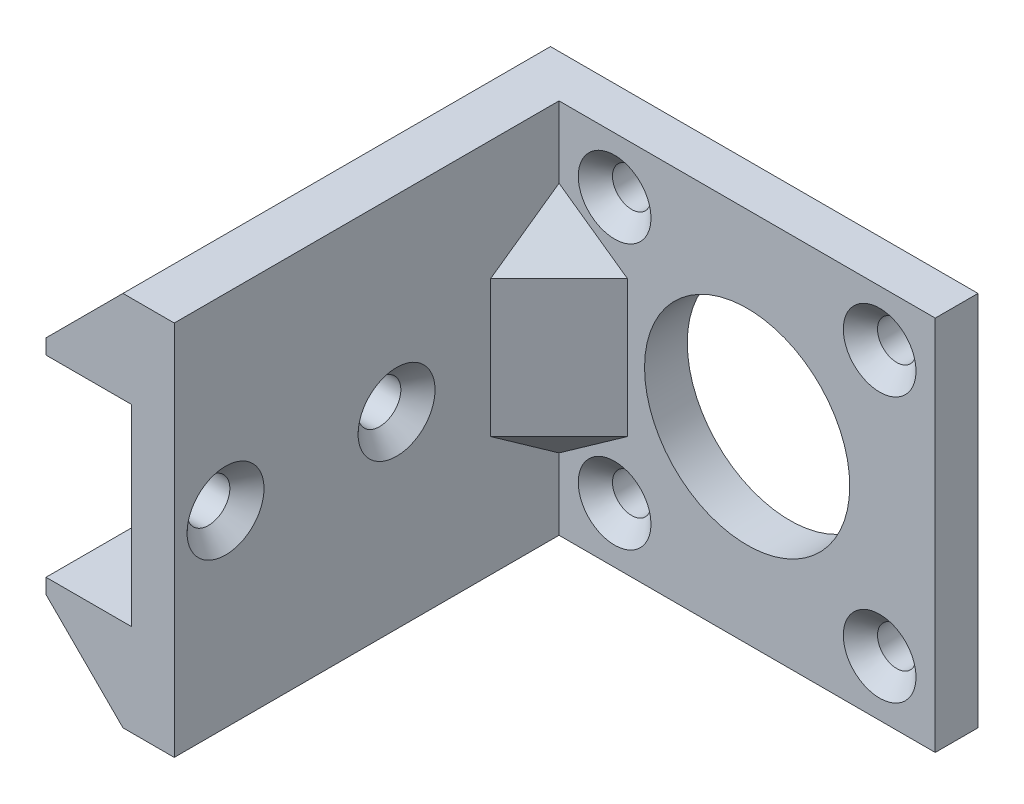
ISO-10303-21;
HEADER;
FILE_DESCRIPTION(('STEP AP214'),'2;1');
FILE_NAME('part.step','',(''),(''),'','','');
FILE_SCHEMA(('AUTOMOTIVE_DESIGN { 1 0 10303 214 1 1 1 1 }'));
ENDSEC;
DATA;
#1=APPLICATION_CONTEXT('core data for automotive mechanical design processes');
#2=APPLICATION_PROTOCOL_DEFINITION('international standard','automotive_design',2000,#1);
#3=PRODUCT_CONTEXT('',#1,'mechanical');
#4=PRODUCT('Part','Part','',(#3));
#5=PRODUCT_RELATED_PRODUCT_CATEGORY('part','',(#4));
#6=PRODUCT_DEFINITION_FORMATION('','',#4);
#7=PRODUCT_DEFINITION_CONTEXT('part definition',#1,'design');
#8=PRODUCT_DEFINITION('design','',#6,#7);
#9=PRODUCT_DEFINITION_SHAPE('','',#8);
#10=(LENGTH_UNIT() NAMED_UNIT(*) SI_UNIT(.MILLI.,.METRE.));
#11=(NAMED_UNIT(*) PLANE_ANGLE_UNIT() SI_UNIT($,.RADIAN.));
#12=(NAMED_UNIT(*) SI_UNIT($,.STERADIAN.) SOLID_ANGLE_UNIT());
#13=UNCERTAINTY_MEASURE_WITH_UNIT(LENGTH_MEASURE(1.E-05),#10,'distance_accuracy_value','');
#14=(GEOMETRIC_REPRESENTATION_CONTEXT(3) GLOBAL_UNCERTAINTY_ASSIGNED_CONTEXT((#13)) GLOBAL_UNIT_ASSIGNED_CONTEXT((#10,
#11,#12)) REPRESENTATION_CONTEXT('',''));
#15=CARTESIAN_POINT('',(0.,0.,0.));
#16=DIRECTION('',(0.,0.,1.));
#17=DIRECTION('',(1.,0.,0.));
#18=AXIS2_PLACEMENT_3D('',#15,#16,#17);
#19=CARTESIAN_POINT('',(-27.,0.,0.));
#20=DIRECTION('',(-1.,0.,0.));
#21=DIRECTION('',(0.,-1.,0.));
#22=AXIS2_PLACEMENT_3D('',#19,#20,#21);
#23=PLANE('',#22);
#24=CARTESIAN_POINT('',(-27.,0.,44.));
#25=DIRECTION('',(-1.,0.,0.));
#26=DIRECTION('',(0.,-1.,0.));
#27=AXIS2_PLACEMENT_3D('',#24,#25,#26);
#28=CIRCLE('',#27,2.5);
#29=CARTESIAN_POINT('',(-27.,-2.5,44.));
#30=VERTEX_POINT('',#29);
#31=EDGE_CURVE('E196',#30,#30,#28,.T.);
#32=ORIENTED_EDGE('',*,*,#31,.F.);
#33=EDGE_LOOP('',(#32));
#34=FACE_BOUND('',#33,.T.);
#35=CARTESIAN_POINT('',(-27.,0.,24.));
#36=DIRECTION('',(-1.,0.,0.));
#37=DIRECTION('',(0.,-1.,0.));
#38=AXIS2_PLACEMENT_3D('',#35,#36,#37);
#39=CIRCLE('',#38,2.5);
#40=CARTESIAN_POINT('',(-27.,-2.5,24.));
#41=VERTEX_POINT('',#40);
#42=EDGE_CURVE('E193',#41,#41,#39,.T.);
#43=ORIENTED_EDGE('',*,*,#42,.F.);
#44=EDGE_LOOP('',(#43));
#45=FACE_BOUND('',#44,.T.);
#46=DIRECTION('',(0.,-1.,0.));
#47=VECTOR('',#46,1.);
#48=CARTESIAN_POINT('',(-27.,22.,0.));
#49=LINE('',#48,#47);
#50=CARTESIAN_POINT('',(-27.,11.25,0.));
#51=VERTEX_POINT('',#50);
#52=CARTESIAN_POINT('',(-27.,-11.25,0.));
#53=VERTEX_POINT('',#52);
#54=EDGE_CURVE('E200',#51,#53,#49,.T.);
#55=ORIENTED_EDGE('',*,*,#54,.T.);
#56=DIRECTION('',(0.,0.,-1.));
#57=VECTOR('',#56,1.);
#58=CARTESIAN_POINT('',(-27.,-11.25,50.));
#59=LINE('',#58,#57);
#60=CARTESIAN_POINT('',(-27.,-11.25,50.));
#61=VERTEX_POINT('',#60);
#62=EDGE_CURVE('E152',#61,#53,#59,.T.);
#63=ORIENTED_EDGE('',*,*,#62,.F.);
#64=DIRECTION('',(0.,1.,0.));
#65=VECTOR('',#64,1.);
#66=CARTESIAN_POINT('',(-27.,22.,50.));
#67=LINE('',#66,#65);
#68=CARTESIAN_POINT('',(-27.,11.25,50.));
#69=VERTEX_POINT('',#68);
#70=EDGE_CURVE('E166',#61,#69,#67,.T.);
#71=ORIENTED_EDGE('',*,*,#70,.T.);
#72=DIRECTION('',(0.,0.,1.));
#73=VECTOR('',#72,1.);
#74=CARTESIAN_POINT('',(-27.,11.25,50.));
#75=LINE('',#74,#73);
#76=EDGE_CURVE('E168',#51,#69,#75,.T.);
#77=ORIENTED_EDGE('',*,*,#76,.F.);
#78=EDGE_LOOP('',(#55,#63,#71,#77));
#79=FACE_BOUND('',#78,.T.);
#80=ADVANCED_FACE('F34',(#34,#45,#79),#23,.T.);
#81=CARTESIAN_POINT('',(0.,0.,5.));
#82=DIRECTION('',(0.,0.,-1.));
#83=DIRECTION('',(-1.,0.,0.));
#84=AXIS2_PLACEMENT_3D('',#81,#82,#83);
#85=PLANE('',#84);
#86=CARTESIAN_POINT('',(-15.5,-15.5,5.));
#87=DIRECTION('',(0.,0.,-1.));
#88=DIRECTION('',(-1.,0.,0.));
#89=AXIS2_PLACEMENT_3D('',#86,#87,#88);
#90=CIRCLE('',#89,4.25000000000002);
#91=CARTESIAN_POINT('',(-19.75,-15.5,5.));
#92=VERTEX_POINT('',#91);
#93=EDGE_CURVE('E311',#92,#92,#90,.T.);
#94=ORIENTED_EDGE('',*,*,#93,.T.);
#95=EDGE_LOOP('',(#94));
#96=FACE_BOUND('',#95,.T.);
#97=CARTESIAN_POINT('',(15.5000000000001,-15.4999999999999,5.));
#98=DIRECTION('',(0.,0.,-1.));
#99=DIRECTION('',(-1.,0.,0.));
#100=AXIS2_PLACEMENT_3D('',#97,#98,#99);
#101=CIRCLE('',#100,4.25000000000002);
#102=CARTESIAN_POINT('',(11.25,-15.4999999999999,5.));
#103=VERTEX_POINT('',#102);
#104=EDGE_CURVE('E308',#103,#103,#101,.T.);
#105=ORIENTED_EDGE('',*,*,#104,.T.);
#106=EDGE_LOOP('',(#105));
#107=FACE_BOUND('',#106,.T.);
#108=CARTESIAN_POINT('',(-15.5000000000002,15.4999999999998,5.));
#109=DIRECTION('',(0.,0.,-1.));
#110=DIRECTION('',(-1.,0.,0.));
#111=AXIS2_PLACEMENT_3D('',#108,#109,#110);
#112=CIRCLE('',#111,4.25);
#113=CARTESIAN_POINT('',(-19.7500000000002,15.4999999999998,5.));
#114=VERTEX_POINT('',#113);
#115=EDGE_CURVE('E305',#114,#114,#112,.T.);
#116=ORIENTED_EDGE('',*,*,#115,.T.);
#117=EDGE_LOOP('',(#116));
#118=FACE_BOUND('',#117,.T.);
#119=CARTESIAN_POINT('',(15.5,15.5,5.));
#120=DIRECTION('',(0.,0.,-1.));
#121=DIRECTION('',(-1.,0.,0.));
#122=AXIS2_PLACEMENT_3D('',#119,#120,#121);
#123=CIRCLE('',#122,4.25000000000002);
#124=CARTESIAN_POINT('',(11.25,15.5,5.));
#125=VERTEX_POINT('',#124);
#126=EDGE_CURVE('E302',#125,#125,#123,.T.);
#127=ORIENTED_EDGE('',*,*,#126,.T.);
#128=EDGE_LOOP('',(#127));
#129=FACE_BOUND('',#128,.T.);
#130=CARTESIAN_POINT('',(0.,0.,5.));
#131=DIRECTION('',(0.,0.,1.));
#132=DIRECTION('',(1.,0.,0.));
#133=AXIS2_PLACEMENT_3D('',#130,#131,#132);
#134=CIRCLE('',#133,12.);
#135=CARTESIAN_POINT('',(12.,0.,5.));
#136=VERTEX_POINT('',#135);
#137=EDGE_CURVE('E216',#136,#136,#134,.T.);
#138=ORIENTED_EDGE('',*,*,#137,.F.);
#139=EDGE_LOOP('',(#138));
#140=FACE_BOUND('',#139,.T.);
#141=DIRECTION('',(0.,-1.,0.));
#142=VECTOR('',#141,1.);
#143=CARTESIAN_POINT('',(-22.,22.,5.));
#144=LINE('',#143,#142);
#145=CARTESIAN_POINT('',(-22.,22.,5.));
#146=VERTEX_POINT('',#145);
#147=CARTESIAN_POINT('',(-22.,13.6568542494923,5.));
#148=VERTEX_POINT('',#147);
#149=EDGE_CURVE('E242',#146,#148,#144,.T.);
#150=ORIENTED_EDGE('',*,*,#149,.T.);
#151=DIRECTION('',(0.816496580927729,-0.577350269189622,0.));
#152=VECTOR('',#151,1.);
#153=CARTESIAN_POINT('',(-0.895430500338385,-1.26632995774108,5.));
#154=LINE('',#153,#152);
#155=CARTESIAN_POINT('',(-14.,7.99999999999995,5.));
#156=VERTEX_POINT('',#155);
#157=EDGE_CURVE('E271',#148,#156,#154,.T.);
#158=ORIENTED_EDGE('',*,*,#157,.T.);
#159=DIRECTION('',(0.,-1.,0.));
#160=VECTOR('',#159,1.);
#161=CARTESIAN_POINT('',(-14.,15.,5.));
#162=LINE('',#161,#160);
#163=CARTESIAN_POINT('',(-14.,-7.99999999999988,5.));
#164=VERTEX_POINT('',#163);
#165=EDGE_CURVE('E187',#156,#164,#162,.T.);
#166=ORIENTED_EDGE('',*,*,#165,.T.);
#167=DIRECTION('',(0.816496580927723,0.57735026918963,0.));
#168=VECTOR('',#167,1.);
#169=CARTESIAN_POINT('',(-0.895430500338526,1.26632995774126,5.));
#170=LINE('',#169,#168);
#171=CARTESIAN_POINT('',(-22.,-13.6568542494923,5.));
#172=VERTEX_POINT('',#171);
#173=EDGE_CURVE('E263',#164,#172,#170,.F.);
#174=ORIENTED_EDGE('',*,*,#173,.T.);
#175=CARTESIAN_POINT('',(-22.,-22.,5.));
#176=VERTEX_POINT('',#175);
#177=EDGE_CURVE('E241',#172,#176,#144,.T.);
#178=ORIENTED_EDGE('',*,*,#177,.T.);
#179=DIRECTION('',(1.,0.,0.));
#180=VECTOR('',#179,1.);
#181=CARTESIAN_POINT('',(22.,-22.,5.));
#182=LINE('',#181,#180);
#183=CARTESIAN_POINT('',(22.,-22.,5.));
#184=VERTEX_POINT('',#183);
#185=EDGE_CURVE('E244',#176,#184,#182,.T.);
#186=ORIENTED_EDGE('',*,*,#185,.T.);
#187=DIRECTION('',(0.,1.,0.));
#188=VECTOR('',#187,1.);
#189=CARTESIAN_POINT('',(22.,22.,5.));
#190=LINE('',#189,#188);
#191=CARTESIAN_POINT('',(22.,22.,5.));
#192=VERTEX_POINT('',#191);
#193=EDGE_CURVE('E234',#184,#192,#190,.T.);
#194=ORIENTED_EDGE('',*,*,#193,.T.);
#195=DIRECTION('',(-1.,0.,0.));
#196=VECTOR('',#195,1.);
#197=CARTESIAN_POINT('',(22.,22.,5.));
#198=LINE('',#197,#196);
#199=EDGE_CURVE('E237',#192,#146,#198,.T.);
#200=ORIENTED_EDGE('',*,*,#199,.T.);
#201=EDGE_LOOP('',(#150,#158,#166,#174,#178,#186,#194,#200));
#202=FACE_BOUND('',#201,.T.);
#203=ADVANCED_FACE('F337',(#96,#107,#118,#129,#140,#202),#85,.F.);
#204=CARTESIAN_POINT('',(0.,0.,0.));
#205=DIRECTION('',(0.,0.,-1.));
#206=DIRECTION('',(-1.,0.,0.));
#207=AXIS2_PLACEMENT_3D('',#204,#205,#206);
#208=PLANE('',#207);
#209=CARTESIAN_POINT('',(-15.5000000000002,15.4999999999998,0.));
#210=DIRECTION('',(0.,0.,1.));
#211=DIRECTION('',(1.,0.,0.));
#212=AXIS2_PLACEMENT_3D('',#209,#210,#211);
#213=CIRCLE('',#212,2.25);
#214=CARTESIAN_POINT('',(-13.2500000000002,15.4999999999998,0.));
#215=VERTEX_POINT('',#214);
#216=EDGE_CURVE('E219',#215,#215,#213,.T.);
#217=ORIENTED_EDGE('',*,*,#216,.T.);
#218=EDGE_LOOP('',(#217));
#219=FACE_BOUND('',#218,.T.);
#220=CARTESIAN_POINT('',(15.5000000000001,-15.4999999999999,0.));
#221=DIRECTION('',(0.,0.,1.));
#222=DIRECTION('',(1.,0.,0.));
#223=AXIS2_PLACEMENT_3D('',#220,#221,#222);
#224=CIRCLE('',#223,2.25);
#225=CARTESIAN_POINT('',(17.7500000000001,-15.4999999999999,0.));
#226=VERTEX_POINT('',#225);
#227=EDGE_CURVE('E227',#226,#226,#224,.T.);
#228=ORIENTED_EDGE('',*,*,#227,.T.);
#229=EDGE_LOOP('',(#228));
#230=FACE_BOUND('',#229,.T.);
#231=DIRECTION('',(1.,0.,0.));
#232=VECTOR('',#231,1.);
#233=CARTESIAN_POINT('',(22.,-22.,0.));
#234=LINE('',#233,#232);
#235=CARTESIAN_POINT('',(-27.9999999999999,-22.,0.));
#236=VERTEX_POINT('',#235);
#237=CARTESIAN_POINT('',(22.,-22.,0.));
#238=VERTEX_POINT('',#237);
#239=EDGE_CURVE('E238',#236,#238,#234,.T.);
#240=ORIENTED_EDGE('',*,*,#239,.F.);
#241=DIRECTION('',(-0.707106781186549,0.707106781186546,0.));
#242=VECTOR('',#241,1.);
#243=CARTESIAN_POINT('',(-24.9999999999999,-25.,0.));
#244=LINE('',#243,#242);
#245=CARTESIAN_POINT('',(-37.,-13.,0.));
#246=VERTEX_POINT('',#245);
#247=EDGE_CURVE('E293',#236,#246,#244,.T.);
#248=ORIENTED_EDGE('',*,*,#247,.T.);
#249=DIRECTION('',(0.,-1.,0.));
#250=VECTOR('',#249,1.);
#251=CARTESIAN_POINT('',(-37.,-22.,0.));
#252=LINE('',#251,#250);
#253=CARTESIAN_POINT('',(-37.,-11.25,0.));
#254=VERTEX_POINT('',#253);
#255=EDGE_CURVE('E162',#254,#246,#252,.T.);
#256=ORIENTED_EDGE('',*,*,#255,.F.);
#257=DIRECTION('',(1.,0.,0.));
#258=VECTOR('',#257,1.);
#259=CARTESIAN_POINT('',(-37.,-11.25,0.));
#260=LINE('',#259,#258);
#261=EDGE_CURVE('E160',#254,#53,#260,.T.);
#262=ORIENTED_EDGE('',*,*,#261,.T.);
#263=ORIENTED_EDGE('',*,*,#54,.F.);
#264=DIRECTION('',(1.,0.,0.));
#265=VECTOR('',#264,1.);
#266=CARTESIAN_POINT('',(-37.,11.25,0.));
#267=LINE('',#266,#265);
#268=CARTESIAN_POINT('',(-37.,11.25,0.));
#269=VERTEX_POINT('',#268);
#270=EDGE_CURVE('E184',#269,#51,#267,.T.);
#271=ORIENTED_EDGE('',*,*,#270,.F.);
#272=DIRECTION('',(0.,-1.,0.));
#273=VECTOR('',#272,1.);
#274=CARTESIAN_POINT('',(-37.,22.,0.));
#275=LINE('',#274,#273);
#276=CARTESIAN_POINT('',(-37.,13.,0.));
#277=VERTEX_POINT('',#276);
#278=EDGE_CURVE('E178',#277,#269,#275,.T.);
#279=ORIENTED_EDGE('',*,*,#278,.F.);
#280=DIRECTION('',(-0.707106781186549,-0.707106781186546,0.));
#281=VECTOR('',#280,1.);
#282=CARTESIAN_POINT('',(-24.9999999999999,25.,0.));
#283=LINE('',#282,#281);
#284=CARTESIAN_POINT('',(-28.,22.,0.));
#285=VERTEX_POINT('',#284);
#286=EDGE_CURVE('E50',#277,#285,#283,.F.);
#287=ORIENTED_EDGE('',*,*,#286,.T.);
#288=DIRECTION('',(-1.,0.,0.));
#289=VECTOR('',#288,1.);
#290=CARTESIAN_POINT('',(22.,22.,0.));
#291=LINE('',#290,#289);
#292=CARTESIAN_POINT('',(22.,22.,0.));
#293=VERTEX_POINT('',#292);
#294=EDGE_CURVE('E249',#293,#285,#291,.T.);
#295=ORIENTED_EDGE('',*,*,#294,.F.);
#296=DIRECTION('',(0.,1.,0.));
#297=VECTOR('',#296,1.);
#298=CARTESIAN_POINT('',(22.,22.,0.));
#299=LINE('',#298,#297);
#300=EDGE_CURVE('E233',#238,#293,#299,.T.);
#301=ORIENTED_EDGE('',*,*,#300,.F.);
#302=EDGE_LOOP('',(#240,#248,#256,#262,#263,#271,#279,#287,#295,#301));
#303=FACE_BOUND('',#302,.T.);
#304=CARTESIAN_POINT('',(15.5,15.5,0.));
#305=DIRECTION('',(0.,0.,1.));
#306=DIRECTION('',(1.,0.,0.));
#307=AXIS2_PLACEMENT_3D('',#304,#305,#306);
#308=CIRCLE('',#307,2.25);
#309=CARTESIAN_POINT('',(17.75,15.5,0.));
#310=VERTEX_POINT('',#309);
#311=EDGE_CURVE('E230',#310,#310,#308,.T.);
#312=ORIENTED_EDGE('',*,*,#311,.T.);
#313=EDGE_LOOP('',(#312));
#314=FACE_BOUND('',#313,.T.);
#315=CARTESIAN_POINT('',(-15.5,-15.5,0.));
#316=DIRECTION('',(0.,0.,1.));
#317=DIRECTION('',(1.,0.,0.));
#318=AXIS2_PLACEMENT_3D('',#315,#316,#317);
#319=CIRCLE('',#318,2.25);
#320=CARTESIAN_POINT('',(-13.25,-15.5,0.));
#321=VERTEX_POINT('',#320);
#322=EDGE_CURVE('E224',#321,#321,#319,.T.);
#323=ORIENTED_EDGE('',*,*,#322,.T.);
#324=EDGE_LOOP('',(#323));
#325=FACE_BOUND('',#324,.T.);
#326=CARTESIAN_POINT('',(0.,0.,0.));
#327=DIRECTION('',(0.,0.,1.));
#328=DIRECTION('',(1.,0.,0.));
#329=AXIS2_PLACEMENT_3D('',#326,#327,#328);
#330=CIRCLE('',#329,12.);
#331=CARTESIAN_POINT('',(12.,0.,0.));
#332=VERTEX_POINT('',#331);
#333=EDGE_CURVE('E215',#332,#332,#330,.T.);
#334=ORIENTED_EDGE('',*,*,#333,.T.);
#335=EDGE_LOOP('',(#334));
#336=FACE_BOUND('',#335,.T.);
#337=ADVANCED_FACE('F343',(#219,#230,#303,#314,#325,#336),#208,.T.);
#338=CARTESIAN_POINT('',(22.,22.,5.));
#339=DIRECTION('',(-1.,0.,0.));
#340=DIRECTION('',(0.,-1.,0.));
#341=AXIS2_PLACEMENT_3D('',#338,#339,#340);
#342=PLANE('',#341);
#343=ORIENTED_EDGE('',*,*,#300,.T.);
#344=DIRECTION('',(0.,0.,-1.));
#345=VECTOR('',#344,1.);
#346=CARTESIAN_POINT('',(22.,22.,5.));
#347=LINE('',#346,#345);
#348=EDGE_CURVE('E254',#192,#293,#347,.T.);
#349=ORIENTED_EDGE('',*,*,#348,.F.);
#350=ORIENTED_EDGE('',*,*,#193,.F.);
#351=DIRECTION('',(0.,0.,-1.));
#352=VECTOR('',#351,1.);
#353=CARTESIAN_POINT('',(22.,-22.,5.));
#354=LINE('',#353,#352);
#355=EDGE_CURVE('E246',#184,#238,#354,.T.);
#356=ORIENTED_EDGE('',*,*,#355,.T.);
#357=EDGE_LOOP('',(#343,#349,#350,#356));
#358=FACE_BOUND('',#357,.T.);
#359=ADVANCED_FACE('F379',(#358),#342,.F.);
#360=CARTESIAN_POINT('',(22.,22.,5.));
#361=DIRECTION('',(0.,-1.,0.));
#362=DIRECTION('',(1.,0.,0.));
#363=AXIS2_PLACEMENT_3D('',#360,#361,#362);
#364=PLANE('',#363);
#365=ORIENTED_EDGE('',*,*,#294,.T.);
#366=DIRECTION('',(0.,0.,1.));
#367=VECTOR('',#366,1.);
#368=CARTESIAN_POINT('',(-28.,22.,5.));
#369=LINE('',#368,#367);
#370=CARTESIAN_POINT('',(-28.,22.,50.));
#371=VERTEX_POINT('',#370);
#372=EDGE_CURVE('E297',#285,#371,#369,.T.);
#373=ORIENTED_EDGE('',*,*,#372,.T.);
#374=DIRECTION('',(1.,0.,0.));
#375=VECTOR('',#374,1.);
#376=CARTESIAN_POINT('',(-27.,22.,50.));
#377=LINE('',#376,#375);
#378=CARTESIAN_POINT('',(-22.,22.,50.));
#379=VERTEX_POINT('',#378);
#380=EDGE_CURVE('E204',#371,#379,#377,.T.);
#381=ORIENTED_EDGE('',*,*,#380,.T.);
#382=DIRECTION('',(0.,0.,-1.));
#383=VECTOR('',#382,1.);
#384=CARTESIAN_POINT('',(-22.,22.,0.));
#385=LINE('',#384,#383);
#386=EDGE_CURVE('E202',#379,#146,#385,.T.);
#387=ORIENTED_EDGE('',*,*,#386,.T.);
#388=ORIENTED_EDGE('',*,*,#199,.F.);
#389=ORIENTED_EDGE('',*,*,#348,.T.);
#390=EDGE_LOOP('',(#365,#373,#381,#387,#388,#389));
#391=FACE_BOUND('',#390,.T.);
#392=ADVANCED_FACE('F383',(#391),#364,.F.);
#393=CARTESIAN_POINT('',(22.,-22.,5.));
#394=DIRECTION('',(0.,1.,0.));
#395=DIRECTION('',(-1.,0.,0.));
#396=AXIS2_PLACEMENT_3D('',#393,#394,#395);
#397=PLANE('',#396);
#398=DIRECTION('',(1.,0.,0.));
#399=VECTOR('',#398,1.);
#400=CARTESIAN_POINT('',(-27.,-22.,50.));
#401=LINE('',#400,#399);
#402=CARTESIAN_POINT('',(-27.9999999999999,-22.,50.));
#403=VERTEX_POINT('',#402);
#404=CARTESIAN_POINT('',(-22.,-22.,50.));
#405=VERTEX_POINT('',#404);
#406=EDGE_CURVE('E213',#403,#405,#401,.T.);
#407=ORIENTED_EDGE('',*,*,#406,.F.);
#408=DIRECTION('',(0.,0.,-1.));
#409=VECTOR('',#408,1.);
#410=CARTESIAN_POINT('',(-27.9999999999999,-22.,0.));
#411=LINE('',#410,#409);
#412=EDGE_CURVE('E290',#403,#236,#411,.T.);
#413=ORIENTED_EDGE('',*,*,#412,.T.);
#414=ORIENTED_EDGE('',*,*,#239,.T.);
#415=ORIENTED_EDGE('',*,*,#355,.F.);
#416=ORIENTED_EDGE('',*,*,#185,.F.);
#417=DIRECTION('',(0.,0.,1.));
#418=VECTOR('',#417,1.);
#419=CARTESIAN_POINT('',(-22.,-22.,0.));
#420=LINE('',#419,#418);
#421=EDGE_CURVE('E199',#176,#405,#420,.T.);
#422=ORIENTED_EDGE('',*,*,#421,.T.);
#423=EDGE_LOOP('',(#407,#413,#414,#415,#416,#422));
#424=FACE_BOUND('',#423,.T.);
#425=ADVANCED_FACE('F374',(#424),#397,.F.);
#426=CARTESIAN_POINT('',(15.5,15.5,5.));
#427=DIRECTION('',(0.,0.,-1.));
#428=DIRECTION('',(-1.,0.,0.));
#429=AXIS2_PLACEMENT_3D('',#426,#427,#428);
#430=CYLINDRICAL_SURFACE('',#429,2.25);
#431=CARTESIAN_POINT('',(15.5,15.5,2.99999999999997));
#432=DIRECTION('',(0.,0.,-1.));
#433=DIRECTION('',(-1.,0.,0.));
#434=AXIS2_PLACEMENT_3D('',#431,#432,#433);
#435=CIRCLE('',#434,2.25);
#436=CARTESIAN_POINT('',(13.25,15.5,2.99999999999997));
#437=VERTEX_POINT('',#436);
#438=EDGE_CURVE('E11',#437,#437,#435,.F.);
#439=ORIENTED_EDGE('',*,*,#438,.T.);
#440=EDGE_LOOP('',(#439));
#441=FACE_BOUND('',#440,.T.);
#442=ORIENTED_EDGE('',*,*,#311,.F.);
#443=EDGE_LOOP('',(#442));
#444=FACE_BOUND('',#443,.T.);
#445=ADVANCED_FACE('F371',(#441,#444),#430,.F.);
#446=CARTESIAN_POINT('',(15.5000000000001,-15.4999999999999,5.));
#447=DIRECTION('',(0.,0.,-1.));
#448=DIRECTION('',(-1.,0.,0.));
#449=AXIS2_PLACEMENT_3D('',#446,#447,#448);
#450=CYLINDRICAL_SURFACE('',#449,2.25);
#451=CARTESIAN_POINT('',(15.5000000000001,-15.4999999999999,2.99999999999998));
#452=DIRECTION('',(0.,0.,-1.));
#453=DIRECTION('',(-1.,0.,0.));
#454=AXIS2_PLACEMENT_3D('',#451,#452,#453);
#455=CIRCLE('',#454,2.25);
#456=CARTESIAN_POINT('',(13.2500000000001,-15.4999999999999,2.99999999999998));
#457=VERTEX_POINT('',#456);
#458=EDGE_CURVE('E314',#457,#457,#455,.F.);
#459=ORIENTED_EDGE('',*,*,#458,.T.);
#460=EDGE_LOOP('',(#459));
#461=FACE_BOUND('',#460,.T.);
#462=ORIENTED_EDGE('',*,*,#227,.F.);
#463=EDGE_LOOP('',(#462));
#464=FACE_BOUND('',#463,.T.);
#465=ADVANCED_FACE('F367',(#461,#464),#450,.F.);
#466=CARTESIAN_POINT('',(-15.5,-15.5,5.));
#467=DIRECTION('',(0.,0.,-1.));
#468=DIRECTION('',(-1.,0.,0.));
#469=AXIS2_PLACEMENT_3D('',#466,#467,#468);
#470=CYLINDRICAL_SURFACE('',#469,2.25);
#471=CARTESIAN_POINT('',(-15.5,-15.5,2.99999999999998));
#472=DIRECTION('',(0.,0.,-1.));
#473=DIRECTION('',(-1.,0.,0.));
#474=AXIS2_PLACEMENT_3D('',#471,#472,#473);
#475=CIRCLE('',#474,2.25);
#476=CARTESIAN_POINT('',(-17.75,-15.5,2.99999999999998));
#477=VERTEX_POINT('',#476);
#478=EDGE_CURVE('E299',#477,#477,#475,.F.);
#479=ORIENTED_EDGE('',*,*,#478,.T.);
#480=EDGE_LOOP('',(#479));
#481=FACE_BOUND('',#480,.T.);
#482=ORIENTED_EDGE('',*,*,#322,.F.);
#483=EDGE_LOOP('',(#482));
#484=FACE_BOUND('',#483,.T.);
#485=ADVANCED_FACE('F364',(#481,#484),#470,.F.);
#486=CARTESIAN_POINT('',(-15.5000000000002,15.4999999999998,5.));
#487=DIRECTION('',(0.,0.,-1.));
#488=DIRECTION('',(-1.,0.,0.));
#489=AXIS2_PLACEMENT_3D('',#486,#487,#488);
#490=CYLINDRICAL_SURFACE('',#489,2.25);
#491=CARTESIAN_POINT('',(-15.5000000000002,15.4999999999998,3.));
#492=DIRECTION('',(0.,0.,-1.));
#493=DIRECTION('',(-1.,0.,0.));
#494=AXIS2_PLACEMENT_3D('',#491,#492,#493);
#495=CIRCLE('',#494,2.25);
#496=CARTESIAN_POINT('',(-17.7500000000002,15.4999999999998,3.));
#497=VERTEX_POINT('',#496);
#498=EDGE_CURVE('E43',#497,#497,#495,.F.);
#499=ORIENTED_EDGE('',*,*,#498,.T.);
#500=EDGE_LOOP('',(#499));
#501=FACE_BOUND('',#500,.T.);
#502=ORIENTED_EDGE('',*,*,#216,.F.);
#503=EDGE_LOOP('',(#502));
#504=FACE_BOUND('',#503,.T.);
#505=ADVANCED_FACE('F319',(#501,#504),#490,.F.);
#506=CARTESIAN_POINT('',(0.,0.,5.));
#507=DIRECTION('',(0.,0.,-1.));
#508=DIRECTION('',(-1.,0.,0.));
#509=AXIS2_PLACEMENT_3D('',#506,#507,#508);
#510=CYLINDRICAL_SURFACE('',#509,12.);
#511=ORIENTED_EDGE('',*,*,#137,.T.);
#512=EDGE_LOOP('',(#511));
#513=FACE_BOUND('',#512,.T.);
#514=ORIENTED_EDGE('',*,*,#333,.F.);
#515=EDGE_LOOP('',(#514));
#516=FACE_BOUND('',#515,.T.);
#517=ADVANCED_FACE('F355',(#513,#516),#510,.F.);
#518=CARTESIAN_POINT('',(-22.,0.,0.));
#519=DIRECTION('',(-1.,0.,0.));
#520=DIRECTION('',(0.,-1.,0.));
#521=AXIS2_PLACEMENT_3D('',#518,#519,#520);
#522=PLANE('',#521);
#523=CARTESIAN_POINT('',(-22.,0.,44.));
#524=DIRECTION('',(-1.,0.,0.));
#525=DIRECTION('',(0.,-1.,0.));
#526=AXIS2_PLACEMENT_3D('',#523,#524,#525);
#527=CIRCLE('',#526,4.49999999999998);
#528=CARTESIAN_POINT('',(-22.,-4.49999999999998,44.));
#529=VERTEX_POINT('',#528);
#530=EDGE_CURVE('E276',#529,#529,#527,.T.);
#531=ORIENTED_EDGE('',*,*,#530,.T.);
#532=EDGE_LOOP('',(#531));
#533=FACE_BOUND('',#532,.T.);
#534=CARTESIAN_POINT('',(-22.,0.,24.));
#535=DIRECTION('',(-1.,0.,0.));
#536=DIRECTION('',(0.,-1.,0.));
#537=AXIS2_PLACEMENT_3D('',#534,#535,#536);
#538=CIRCLE('',#537,4.49999999999998);
#539=CARTESIAN_POINT('',(-22.,-4.49999999999999,24.));
#540=VERTEX_POINT('',#539);
#541=EDGE_CURVE('E273',#540,#540,#538,.T.);
#542=ORIENTED_EDGE('',*,*,#541,.T.);
#543=EDGE_LOOP('',(#542));
#544=FACE_BOUND('',#543,.T.);
#545=DIRECTION('',(0.,-1.,0.));
#546=VECTOR('',#545,1.);
#547=CARTESIAN_POINT('',(-22.,15.,13.));
#548=LINE('',#547,#546);
#549=CARTESIAN_POINT('',(-22.,7.99999999999995,13.));
#550=VERTEX_POINT('',#549);
#551=CARTESIAN_POINT('',(-22.,-7.99999999999988,13.));
#552=VERTEX_POINT('',#551);
#553=EDGE_CURVE('E190',#550,#552,#548,.T.);
#554=ORIENTED_EDGE('',*,*,#553,.F.);
#555=DIRECTION('',(0.,0.577350269189622,-0.816496580927729));
#556=VECTOR('',#555,1.);
#557=CARTESIAN_POINT('',(-22.,11.4615921036167,8.1045694996615));
#558=LINE('',#557,#556);
#559=EDGE_CURVE('E268',#550,#148,#558,.T.);
#560=ORIENTED_EDGE('',*,*,#559,.T.);
#561=ORIENTED_EDGE('',*,*,#149,.F.);
#562=ORIENTED_EDGE('',*,*,#386,.F.);
#563=DIRECTION('',(0.,1.,0.));
#564=VECTOR('',#563,1.);
#565=CARTESIAN_POINT('',(-22.,22.,50.));
#566=LINE('',#565,#564);
#567=EDGE_CURVE('E207',#405,#379,#566,.T.);
#568=ORIENTED_EDGE('',*,*,#567,.F.);
#569=ORIENTED_EDGE('',*,*,#421,.F.);
#570=ORIENTED_EDGE('',*,*,#177,.F.);
#571=DIRECTION('',(0.,-0.57735026918963,-0.816496580927723));
#572=VECTOR('',#571,1.);
#573=CARTESIAN_POINT('',(-22.,-11.4615921036166,8.1045694996616));
#574=LINE('',#573,#572);
#575=EDGE_CURVE('E266',#172,#552,#574,.F.);
#576=ORIENTED_EDGE('',*,*,#575,.T.);
#577=EDGE_LOOP('',(#554,#560,#561,#562,#568,#569,#570,#576));
#578=FACE_BOUND('',#577,.T.);
#579=ADVANCED_FACE('F352',(#533,#544,#578),#522,.F.);
#580=CARTESIAN_POINT('',(-27.,22.,50.));
#581=DIRECTION('',(0.,0.,-1.));
#582=DIRECTION('',(-1.,0.,0.));
#583=AXIS2_PLACEMENT_3D('',#580,#581,#582);
#584=PLANE('',#583);
#585=DIRECTION('',(0.,1.,0.));
#586=VECTOR('',#585,1.);
#587=CARTESIAN_POINT('',(-37.,-22.,50.));
#588=LINE('',#587,#586);
#589=CARTESIAN_POINT('',(-37.,-13.,50.));
#590=VERTEX_POINT('',#589);
#591=CARTESIAN_POINT('',(-37.,-11.25,50.));
#592=VERTEX_POINT('',#591);
#593=EDGE_CURVE('E142',#590,#592,#588,.T.);
#594=ORIENTED_EDGE('',*,*,#593,.F.);
#595=DIRECTION('',(0.707106781186549,-0.707106781186546,0.));
#596=VECTOR('',#595,1.);
#597=CARTESIAN_POINT('',(-37.,-13.,50.));
#598=LINE('',#597,#596);
#599=EDGE_CURVE('E288',#590,#403,#598,.T.);
#600=ORIENTED_EDGE('',*,*,#599,.T.);
#601=ORIENTED_EDGE('',*,*,#406,.T.);
#602=ORIENTED_EDGE('',*,*,#567,.T.);
#603=ORIENTED_EDGE('',*,*,#380,.F.);
#604=DIRECTION('',(0.707106781186549,0.707106781186546,0.));
#605=VECTOR('',#604,1.);
#606=CARTESIAN_POINT('',(-37.,13.,50.));
#607=LINE('',#606,#605);
#608=CARTESIAN_POINT('',(-37.,13.,50.));
#609=VERTEX_POINT('',#608);
#610=EDGE_CURVE('E286',#371,#609,#607,.F.);
#611=ORIENTED_EDGE('',*,*,#610,.T.);
#612=DIRECTION('',(0.,1.,0.));
#613=VECTOR('',#612,1.);
#614=CARTESIAN_POINT('',(-37.,22.,50.));
#615=LINE('',#614,#613);
#616=CARTESIAN_POINT('',(-37.,11.25,50.));
#617=VERTEX_POINT('',#616);
#618=EDGE_CURVE('E171',#617,#609,#615,.T.);
#619=ORIENTED_EDGE('',*,*,#618,.F.);
#620=DIRECTION('',(1.,0.,0.));
#621=VECTOR('',#620,1.);
#622=CARTESIAN_POINT('',(-37.,11.25,50.));
#623=LINE('',#622,#621);
#624=EDGE_CURVE('E181',#617,#69,#623,.T.);
#625=ORIENTED_EDGE('',*,*,#624,.T.);
#626=ORIENTED_EDGE('',*,*,#70,.F.);
#627=DIRECTION('',(1.,0.,0.));
#628=VECTOR('',#627,1.);
#629=CARTESIAN_POINT('',(-37.,-11.25,50.));
#630=LINE('',#629,#628);
#631=EDGE_CURVE('E158',#592,#61,#630,.T.);
#632=ORIENTED_EDGE('',*,*,#631,.F.);
#633=EDGE_LOOP('',(#594,#600,#601,#602,#603,#611,#619,#625,#626,#632));
#634=FACE_BOUND('',#633,.T.);
#635=ADVANCED_FACE('F164',(#634),#584,.F.);
#636=CARTESIAN_POINT('',(-27.,0.,44.));
#637=DIRECTION('',(1.,0.,0.));
#638=DIRECTION('',(0.,1.,0.));
#639=AXIS2_PLACEMENT_3D('',#636,#637,#638);
#640=CYLINDRICAL_SURFACE('',#639,2.5);
#641=CARTESIAN_POINT('',(-24.,0.,44.));
#642=DIRECTION('',(-1.,0.,0.));
#643=DIRECTION('',(0.,-1.,0.));
#644=AXIS2_PLACEMENT_3D('',#641,#642,#643);
#645=CIRCLE('',#644,2.5);
#646=CARTESIAN_POINT('',(-24.,-2.5,44.));
#647=VERTEX_POINT('',#646);
#648=EDGE_CURVE('E279',#647,#647,#645,.F.);
#649=ORIENTED_EDGE('',*,*,#648,.T.);
#650=EDGE_LOOP('',(#649));
#651=FACE_BOUND('',#650,.T.);
#652=ORIENTED_EDGE('',*,*,#31,.T.);
#653=EDGE_LOOP('',(#652));
#654=FACE_BOUND('',#653,.T.);
#655=ADVANCED_FACE('F350',(#651,#654),#640,.F.);
#656=CARTESIAN_POINT('',(-27.,0.,24.));
#657=DIRECTION('',(1.,0.,0.));
#658=DIRECTION('',(0.,1.,0.));
#659=AXIS2_PLACEMENT_3D('',#656,#657,#658);
#660=CYLINDRICAL_SURFACE('',#659,2.5);
#661=CARTESIAN_POINT('',(-24.,0.,24.));
#662=DIRECTION('',(-1.,0.,0.));
#663=DIRECTION('',(0.,-1.,0.));
#664=AXIS2_PLACEMENT_3D('',#661,#662,#663);
#665=CIRCLE('',#664,2.5);
#666=CARTESIAN_POINT('',(-24.,-2.5,24.));
#667=VERTEX_POINT('',#666);
#668=EDGE_CURVE('E282',#667,#667,#665,.F.);
#669=ORIENTED_EDGE('',*,*,#668,.T.);
#670=EDGE_LOOP('',(#669));
#671=FACE_BOUND('',#670,.T.);
#672=ORIENTED_EDGE('',*,*,#42,.T.);
#673=EDGE_LOOP('',(#672));
#674=FACE_BOUND('',#673,.T.);
#675=ADVANCED_FACE('F509',(#671,#674),#660,.F.);
#676=CARTESIAN_POINT('',(-14.,15.,5.));
#677=DIRECTION('',(-0.707106781186547,0.,-0.707106781186547));
#678=DIRECTION('',(-0.707106781186548,0.,0.707106781186548));
#679=AXIS2_PLACEMENT_3D('',#676,#677,#678);
#680=PLANE('',#679);
#681=ORIENTED_EDGE('',*,*,#553,.T.);
#682=DIRECTION('',(0.707106781186548,0.,-0.707106781186548));
#683=VECTOR('',#682,1.);
#684=CARTESIAN_POINT('',(-14.,-7.99999999999988,5.));
#685=LINE('',#684,#683);
#686=EDGE_CURVE('E260',#552,#164,#685,.T.);
#687=ORIENTED_EDGE('',*,*,#686,.T.);
#688=ORIENTED_EDGE('',*,*,#165,.F.);
#689=DIRECTION('',(-0.707106781186548,0.,0.707106781186548));
#690=VECTOR('',#689,1.);
#691=CARTESIAN_POINT('',(-22.,7.99999999999995,13.));
#692=LINE('',#691,#690);
#693=EDGE_CURVE('E257',#156,#550,#692,.T.);
#694=ORIENTED_EDGE('',*,*,#693,.T.);
#695=EDGE_LOOP('',(#681,#687,#688,#694));
#696=FACE_BOUND('',#695,.T.);
#697=ADVANCED_FACE('F399',(#696),#680,.F.);
#698=CARTESIAN_POINT('',(-14.,-7.99999999999988,5.));
#699=DIRECTION('',(-0.500000000000003,0.707106781186544,-0.500000000000003));
#700=DIRECTION('',(0.707106781186548,0.,-0.707106781186548));
#701=AXIS2_PLACEMENT_3D('',#698,#699,#700);
#702=PLANE('',#701);
#703=ORIENTED_EDGE('',*,*,#686,.F.);
#704=ORIENTED_EDGE('',*,*,#575,.F.);
#705=ORIENTED_EDGE('',*,*,#173,.F.);
#706=EDGE_LOOP('',(#703,#704,#705));
#707=FACE_BOUND('',#706,.T.);
#708=ADVANCED_FACE('F392',(#707),#702,.F.);
#709=CARTESIAN_POINT('',(-9.44974746830592,15.,-9.44974746830592));
#710=DIRECTION('',(0.499999999999998,0.707106781186551,0.499999999999998));
#711=DIRECTION('',(-0.707106781186548,0.,0.707106781186548));
#712=AXIS2_PLACEMENT_3D('',#709,#710,#711);
#713=PLANE('',#712);
#714=ORIENTED_EDGE('',*,*,#559,.F.);
#715=ORIENTED_EDGE('',*,*,#693,.F.);
#716=ORIENTED_EDGE('',*,*,#157,.F.);
#717=EDGE_LOOP('',(#714,#715,#716));
#718=FACE_BOUND('',#717,.T.);
#719=ADVANCED_FACE('F398',(#718),#713,.T.);
#720=CARTESIAN_POINT('',(-22.,0.,44.));
#721=DIRECTION('',(1.,0.,0.));
#722=DIRECTION('',(0.,1.,0.));
#723=AXIS2_PLACEMENT_3D('',#720,#721,#722);
#724=CONICAL_SURFACE('',#723,4.49999999999998,0.785398163397447);
#725=ORIENTED_EDGE('',*,*,#648,.F.);
#726=EDGE_LOOP('',(#725));
#727=FACE_BOUND('',#726,.T.);
#728=ORIENTED_EDGE('',*,*,#530,.F.);
#729=EDGE_LOOP('',(#728));
#730=FACE_BOUND('',#729,.T.);
#731=ADVANCED_FACE('F406',(#727,#730),#724,.F.);
#732=CARTESIAN_POINT('',(-22.,0.,24.));
#733=DIRECTION('',(1.,0.,0.));
#734=DIRECTION('',(0.,1.,0.));
#735=AXIS2_PLACEMENT_3D('',#732,#733,#734);
#736=CONICAL_SURFACE('',#735,4.49999999999998,0.785398163397447);
#737=ORIENTED_EDGE('',*,*,#668,.F.);
#738=EDGE_LOOP('',(#737));
#739=FACE_BOUND('',#738,.T.);
#740=ORIENTED_EDGE('',*,*,#541,.F.);
#741=EDGE_LOOP('',(#740));
#742=FACE_BOUND('',#741,.T.);
#743=ADVANCED_FACE('F413',(#739,#742),#736,.F.);
#744=CARTESIAN_POINT('',(-37.,11.25,50.));
#745=DIRECTION('',(0.,1.,0.));
#746=DIRECTION('',(-1.,0.,0.));
#747=AXIS2_PLACEMENT_3D('',#744,#745,#746);
#748=PLANE('',#747);
#749=ORIENTED_EDGE('',*,*,#76,.T.);
#750=ORIENTED_EDGE('',*,*,#624,.F.);
#751=DIRECTION('',(0.,0.,1.));
#752=VECTOR('',#751,1.);
#753=CARTESIAN_POINT('',(-37.,11.25,50.));
#754=LINE('',#753,#752);
#755=EDGE_CURVE('E180',#269,#617,#754,.T.);
#756=ORIENTED_EDGE('',*,*,#755,.F.);
#757=ORIENTED_EDGE('',*,*,#270,.T.);
#758=EDGE_LOOP('',(#749,#750,#756,#757));
#759=FACE_BOUND('',#758,.T.);
#760=ADVANCED_FACE('F420',(#759),#748,.F.);
#761=CARTESIAN_POINT('',(-37.,0.,0.));
#762=DIRECTION('',(1.,0.,0.));
#763=DIRECTION('',(0.,0.,-1.));
#764=AXIS2_PLACEMENT_3D('',#761,#762,#763);
#765=PLANE('',#764);
#766=ORIENTED_EDGE('',*,*,#618,.T.);
#767=DIRECTION('',(0.,0.,-1.));
#768=VECTOR('',#767,1.);
#769=CARTESIAN_POINT('',(-37.,13.,0.));
#770=LINE('',#769,#768);
#771=EDGE_CURVE('E295',#609,#277,#770,.T.);
#772=ORIENTED_EDGE('',*,*,#771,.T.);
#773=ORIENTED_EDGE('',*,*,#278,.T.);
#774=ORIENTED_EDGE('',*,*,#755,.T.);
#775=EDGE_LOOP('',(#766,#772,#773,#774));
#776=FACE_BOUND('',#775,.T.);
#777=ADVANCED_FACE('F497',(#776),#765,.F.);
#778=CARTESIAN_POINT('',(-37.,-11.25,50.));
#779=DIRECTION('',(0.,-1.,0.));
#780=DIRECTION('',(1.,0.,0.));
#781=AXIS2_PLACEMENT_3D('',#778,#779,#780);
#782=PLANE('',#781);
#783=ORIENTED_EDGE('',*,*,#62,.T.);
#784=ORIENTED_EDGE('',*,*,#261,.F.);
#785=DIRECTION('',(0.,0.,-1.));
#786=VECTOR('',#785,1.);
#787=CARTESIAN_POINT('',(-37.,-11.25,50.));
#788=LINE('',#787,#786);
#789=EDGE_CURVE('E146',#592,#254,#788,.T.);
#790=ORIENTED_EDGE('',*,*,#789,.F.);
#791=ORIENTED_EDGE('',*,*,#631,.T.);
#792=EDGE_LOOP('',(#783,#784,#790,#791));
#793=FACE_BOUND('',#792,.T.);
#794=ADVANCED_FACE('F157',(#793),#782,.F.);
#795=CARTESIAN_POINT('',(-37.,0.,0.));
#796=DIRECTION('',(-1.,0.,0.));
#797=DIRECTION('',(0.,0.,1.));
#798=AXIS2_PLACEMENT_3D('',#795,#796,#797);
#799=PLANE('',#798);
#800=ORIENTED_EDGE('',*,*,#255,.T.);
#801=DIRECTION('',(0.,0.,1.));
#802=VECTOR('',#801,1.);
#803=CARTESIAN_POINT('',(-37.,-13.,50.));
#804=LINE('',#803,#802);
#805=EDGE_CURVE('E149',#246,#590,#804,.T.);
#806=ORIENTED_EDGE('',*,*,#805,.T.);
#807=ORIENTED_EDGE('',*,*,#593,.T.);
#808=ORIENTED_EDGE('',*,*,#789,.T.);
#809=EDGE_LOOP('',(#800,#806,#807,#808));
#810=FACE_BOUND('',#809,.T.);
#811=ADVANCED_FACE('F145',(#810),#799,.T.);
#812=CARTESIAN_POINT('',(-37.,-13.,0.));
#813=DIRECTION('',(-0.707106781186546,-0.707106781186549,0.));
#814=DIRECTION('',(0.,0.,-1.));
#815=AXIS2_PLACEMENT_3D('',#812,#813,#814);
#816=PLANE('',#815);
#817=ORIENTED_EDGE('',*,*,#247,.F.);
#818=ORIENTED_EDGE('',*,*,#412,.F.);
#819=ORIENTED_EDGE('',*,*,#599,.F.);
#820=ORIENTED_EDGE('',*,*,#805,.F.);
#821=EDGE_LOOP('',(#817,#818,#819,#820));
#822=FACE_BOUND('',#821,.T.);
#823=ADVANCED_FACE('F422',(#822),#816,.T.);
#824=CARTESIAN_POINT('',(-37.,13.,0.));
#825=DIRECTION('',(0.707106781186546,-0.707106781186549,0.));
#826=DIRECTION('',(0.,0.,-1.));
#827=AXIS2_PLACEMENT_3D('',#824,#825,#826);
#828=PLANE('',#827);
#829=ORIENTED_EDGE('',*,*,#610,.F.);
#830=ORIENTED_EDGE('',*,*,#372,.F.);
#831=ORIENTED_EDGE('',*,*,#286,.F.);
#832=ORIENTED_EDGE('',*,*,#771,.F.);
#833=EDGE_LOOP('',(#829,#830,#831,#832));
#834=FACE_BOUND('',#833,.T.);
#835=ADVANCED_FACE('F428',(#834),#828,.F.);
#836=CARTESIAN_POINT('',(-15.5,-15.5,2.99999999999998));
#837=DIRECTION('',(0.,0.,1.));
#838=DIRECTION('',(1.,0.,0.));
#839=AXIS2_PLACEMENT_3D('',#836,#837,#838);
#840=CONICAL_SURFACE('',#839,2.25,0.785398163397446);
#841=ORIENTED_EDGE('',*,*,#93,.F.);
#842=EDGE_LOOP('',(#841));
#843=FACE_BOUND('',#842,.T.);
#844=ORIENTED_EDGE('',*,*,#478,.F.);
#845=EDGE_LOOP('',(#844));
#846=FACE_BOUND('',#845,.T.);
#847=ADVANCED_FACE('F331',(#843,#846),#840,.F.);
#848=CARTESIAN_POINT('',(15.5000000000001,-15.4999999999999,2.99999999999998));
#849=DIRECTION('',(0.,0.,1.));
#850=DIRECTION('',(1.,0.,0.));
#851=AXIS2_PLACEMENT_3D('',#848,#849,#850);
#852=CONICAL_SURFACE('',#851,2.25,0.785398163397446);
#853=ORIENTED_EDGE('',*,*,#104,.F.);
#854=EDGE_LOOP('',(#853));
#855=FACE_BOUND('',#854,.T.);
#856=ORIENTED_EDGE('',*,*,#458,.F.);
#857=EDGE_LOOP('',(#856));
#858=FACE_BOUND('',#857,.T.);
#859=ADVANCED_FACE('F324',(#855,#858),#852,.F.);
#860=CARTESIAN_POINT('',(-15.5000000000002,15.4999999999998,3.));
#861=DIRECTION('',(0.,0.,1.));
#862=DIRECTION('',(1.,0.,0.));
#863=AXIS2_PLACEMENT_3D('',#860,#861,#862);
#864=CONICAL_SURFACE('',#863,2.25,0.78539816339745);
#865=ORIENTED_EDGE('',*,*,#115,.F.);
#866=EDGE_LOOP('',(#865));
#867=FACE_BOUND('',#866,.T.);
#868=ORIENTED_EDGE('',*,*,#498,.F.);
#869=EDGE_LOOP('',(#868));
#870=FACE_BOUND('',#869,.T.);
#871=ADVANCED_FACE('F322',(#867,#870),#864,.F.);
#872=CARTESIAN_POINT('',(15.5,15.5,2.99999999999997));
#873=DIRECTION('',(0.,0.,1.));
#874=DIRECTION('',(1.,0.,0.));
#875=AXIS2_PLACEMENT_3D('',#872,#873,#874);
#876=CONICAL_SURFACE('',#875,2.25,0.785398163397446);
#877=ORIENTED_EDGE('',*,*,#126,.F.);
#878=EDGE_LOOP('',(#877));
#879=FACE_BOUND('',#878,.T.);
#880=ORIENTED_EDGE('',*,*,#438,.F.);
#881=EDGE_LOOP('',(#880));
#882=FACE_BOUND('',#881,.T.);
#883=ADVANCED_FACE('F37',(#879,#882),#876,.F.);
#884=CLOSED_SHELL('',(#80,#203,#337,#359,#392,#425,#445,#465,#485,#505,#517,#579,#635,#655,#675,
#697,#708,#719,#731,#743,#760,#777,#794,#811,#823,#835,#847,#859,#871,#883));
#885=MANIFOLD_SOLID_BREP('B2',#884);
#886=ADVANCED_BREP_SHAPE_REPRESENTATION('',(#18,#885),#14);
#887=SHAPE_DEFINITION_REPRESENTATION(#9,#886);
ENDSEC;
END-ISO-10303-21;
